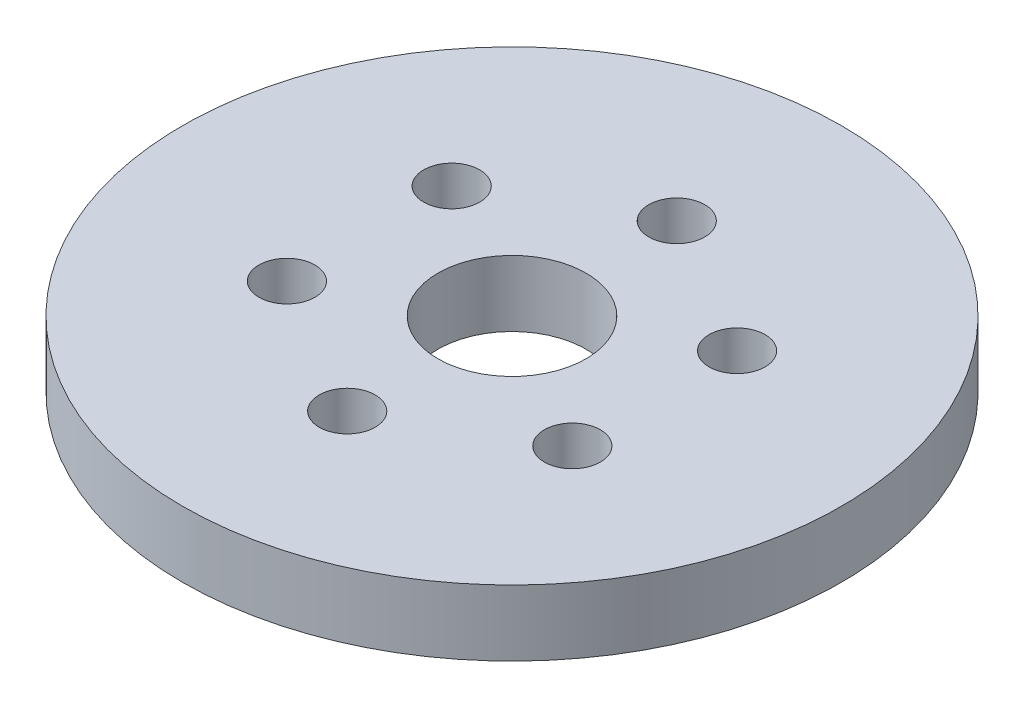
ISO-10303-21;
HEADER;
FILE_DESCRIPTION(('STEP AP214'),'2;1');
FILE_NAME('part.step','',(''),(''),'','','');
FILE_SCHEMA(('AUTOMOTIVE_DESIGN { 1 0 10303 214 1 1 1 1 }'));
ENDSEC;
DATA;
#1=APPLICATION_CONTEXT('core data for automotive mechanical design processes');
#2=APPLICATION_PROTOCOL_DEFINITION('international standard','automotive_design',2000,#1);
#3=PRODUCT_CONTEXT('',#1,'mechanical');
#4=PRODUCT('Part','Part','',(#3));
#5=PRODUCT_RELATED_PRODUCT_CATEGORY('part','',(#4));
#6=PRODUCT_DEFINITION_FORMATION('','',#4);
#7=PRODUCT_DEFINITION_CONTEXT('part definition',#1,'design');
#8=PRODUCT_DEFINITION('design','',#6,#7);
#9=PRODUCT_DEFINITION_SHAPE('','',#8);
#10=(LENGTH_UNIT() NAMED_UNIT(*) SI_UNIT(.MILLI.,.METRE.));
#11=(NAMED_UNIT(*) PLANE_ANGLE_UNIT() SI_UNIT($,.RADIAN.));
#12=(NAMED_UNIT(*) SI_UNIT($,.STERADIAN.) SOLID_ANGLE_UNIT());
#13=UNCERTAINTY_MEASURE_WITH_UNIT(LENGTH_MEASURE(1.E-05),#10,'distance_accuracy_value','');
#14=(GEOMETRIC_REPRESENTATION_CONTEXT(3) GLOBAL_UNCERTAINTY_ASSIGNED_CONTEXT((#13)) GLOBAL_UNIT_ASSIGNED_CONTEXT((#10,
#11,#12)) REPRESENTATION_CONTEXT('',''));
#15=CARTESIAN_POINT('',(0.,0.,0.));
#16=DIRECTION('',(0.,0.,1.));
#17=DIRECTION('',(1.,0.,0.));
#18=AXIS2_PLACEMENT_3D('',#15,#16,#17);
#19=CARTESIAN_POINT('',(0.,4.,0.));
#20=DIRECTION('',(0.,1.,0.));
#21=DIRECTION('',(0.,0.,1.));
#22=AXIS2_PLACEMENT_3D('',#19,#20,#21);
#23=PLANE('',#22);
#24=CARTESIAN_POINT('',(0.,4.,-10.));
#25=DIRECTION('',(0.,1.,0.));
#26=DIRECTION('',(0.,0.,1.));
#27=AXIS2_PLACEMENT_3D('',#24,#25,#26);
#28=CIRCLE('',#27,1.7);
#29=CARTESIAN_POINT('',(0.,4.,-8.3));
#30=VERTEX_POINT('',#29);
#31=EDGE_CURVE('E76',#30,#30,#28,.T.);
#32=ORIENTED_EDGE('',*,*,#31,.F.);
#33=EDGE_LOOP('',(#32));
#34=FACE_BOUND('',#33,.T.);
#35=CARTESIAN_POINT('',(-8.66025403784433,4.,-5.0000000000001));
#36=DIRECTION('',(0.,1.,0.));
#37=DIRECTION('',(0.,0.,1.));
#38=AXIS2_PLACEMENT_3D('',#35,#36,#37);
#39=CIRCLE('',#38,1.7);
#40=CARTESIAN_POINT('',(-8.66025403784433,4.,-3.3000000000001));
#41=VERTEX_POINT('',#40);
#42=EDGE_CURVE('E77',#41,#41,#39,.T.);
#43=ORIENTED_EDGE('',*,*,#42,.F.);
#44=EDGE_LOOP('',(#43));
#45=FACE_BOUND('',#44,.T.);
#46=CARTESIAN_POINT('',(-8.66025403784443,4.,4.99999999999992));
#47=DIRECTION('',(0.,1.,0.));
#48=DIRECTION('',(0.,0.,1.));
#49=AXIS2_PLACEMENT_3D('',#46,#47,#48);
#50=CIRCLE('',#49,1.7);
#51=CARTESIAN_POINT('',(-8.66025403784443,4.,6.69999999999992));
#52=VERTEX_POINT('',#51);
#53=EDGE_CURVE('E51',#52,#52,#50,.T.);
#54=ORIENTED_EDGE('',*,*,#53,.F.);
#55=EDGE_LOOP('',(#54));
#56=FACE_BOUND('',#55,.T.);
#57=CARTESIAN_POINT('',(0.,4.,10.));
#58=DIRECTION('',(0.,1.,0.));
#59=DIRECTION('',(0.,0.,1.));
#60=AXIS2_PLACEMENT_3D('',#57,#58,#59);
#61=CIRCLE('',#60,1.7);
#62=CARTESIAN_POINT('',(0.,4.,11.7));
#63=VERTEX_POINT('',#62);
#64=EDGE_CURVE('E58',#63,#63,#61,.T.);
#65=ORIENTED_EDGE('',*,*,#64,.F.);
#66=EDGE_LOOP('',(#65));
#67=FACE_BOUND('',#66,.T.);
#68=CARTESIAN_POINT('',(8.66025403784437,4.,5.00000000000004));
#69=DIRECTION('',(0.,1.,0.));
#70=DIRECTION('',(0.,0.,1.));
#71=AXIS2_PLACEMENT_3D('',#68,#69,#70);
#72=CIRCLE('',#71,1.7);
#73=CARTESIAN_POINT('',(8.66025403784437,4.,6.70000000000004));
#74=VERTEX_POINT('',#73);
#75=EDGE_CURVE('E64',#74,#74,#72,.T.);
#76=ORIENTED_EDGE('',*,*,#75,.F.);
#77=EDGE_LOOP('',(#76));
#78=FACE_BOUND('',#77,.T.);
#79=CARTESIAN_POINT('',(8.6602540378444,4.,-4.99999999999998));
#80=DIRECTION('',(0.,1.,0.));
#81=DIRECTION('',(0.,0.,1.));
#82=AXIS2_PLACEMENT_3D('',#79,#80,#81);
#83=CIRCLE('',#82,1.7);
#84=CARTESIAN_POINT('',(8.6602540378444,4.,-3.29999999999998));
#85=VERTEX_POINT('',#84);
#86=EDGE_CURVE('E70',#85,#85,#83,.T.);
#87=ORIENTED_EDGE('',*,*,#86,.F.);
#88=EDGE_LOOP('',(#87));
#89=FACE_BOUND('',#88,.T.);
#90=CARTESIAN_POINT('',(0.,4.,0.));
#91=DIRECTION('',(0.,1.,0.));
#92=DIRECTION('',(0.,0.,1.));
#93=AXIS2_PLACEMENT_3D('',#90,#91,#92);
#94=CIRCLE('',#93,20.);
#95=CARTESIAN_POINT('',(0.,4.,20.));
#96=VERTEX_POINT('',#95);
#97=EDGE_CURVE('E10',#96,#96,#94,.T.);
#98=ORIENTED_EDGE('',*,*,#97,.T.);
#99=EDGE_LOOP('',(#98));
#100=FACE_BOUND('',#99,.T.);
#101=CARTESIAN_POINT('',(0.,4.,0.));
#102=DIRECTION('',(0.,1.,0.));
#103=DIRECTION('',(0.,0.,1.));
#104=AXIS2_PLACEMENT_3D('',#101,#102,#103);
#105=CIRCLE('',#104,4.5);
#106=CARTESIAN_POINT('',(0.,4.,4.5));
#107=VERTEX_POINT('',#106);
#108=EDGE_CURVE('E43',#107,#107,#105,.T.);
#109=ORIENTED_EDGE('',*,*,#108,.F.);
#110=EDGE_LOOP('',(#109));
#111=FACE_BOUND('',#110,.T.);
#112=ADVANCED_FACE('F32',(#34,#45,#56,#67,#78,#89,#100,#111),#23,.T.);
#113=CARTESIAN_POINT('',(0.,0.,0.));
#114=DIRECTION('',(0.,1.,0.));
#115=DIRECTION('',(0.,0.,1.));
#116=AXIS2_PLACEMENT_3D('',#113,#114,#115);
#117=PLANE('',#116);
#118=CARTESIAN_POINT('',(0.,0.,-10.));
#119=DIRECTION('',(0.,1.,0.));
#120=DIRECTION('',(0.,0.,1.));
#121=AXIS2_PLACEMENT_3D('',#118,#119,#120);
#122=CIRCLE('',#121,1.7);
#123=CARTESIAN_POINT('',(0.,0.,-8.3));
#124=VERTEX_POINT('',#123);
#125=EDGE_CURVE('E48',#124,#124,#122,.T.);
#126=ORIENTED_EDGE('',*,*,#125,.T.);
#127=EDGE_LOOP('',(#126));
#128=FACE_BOUND('',#127,.T.);
#129=CARTESIAN_POINT('',(-8.66025403784433,0.,-5.0000000000001));
#130=DIRECTION('',(0.,1.,0.));
#131=DIRECTION('',(0.,0.,1.));
#132=AXIS2_PLACEMENT_3D('',#129,#130,#131);
#133=CIRCLE('',#132,1.7);
#134=CARTESIAN_POINT('',(-8.66025403784433,0.,-3.3000000000001));
#135=VERTEX_POINT('',#134);
#136=EDGE_CURVE('E55',#135,#135,#133,.T.);
#137=ORIENTED_EDGE('',*,*,#136,.T.);
#138=EDGE_LOOP('',(#137));
#139=FACE_BOUND('',#138,.T.);
#140=CARTESIAN_POINT('',(-8.66025403784443,0.,4.99999999999992));
#141=DIRECTION('',(0.,1.,0.));
#142=DIRECTION('',(0.,0.,1.));
#143=AXIS2_PLACEMENT_3D('',#140,#141,#142);
#144=CIRCLE('',#143,1.7);
#145=CARTESIAN_POINT('',(-8.66025403784443,0.,6.69999999999992));
#146=VERTEX_POINT('',#145);
#147=EDGE_CURVE('E54',#146,#146,#144,.T.);
#148=ORIENTED_EDGE('',*,*,#147,.T.);
#149=EDGE_LOOP('',(#148));
#150=FACE_BOUND('',#149,.T.);
#151=CARTESIAN_POINT('',(0.,0.,10.));
#152=DIRECTION('',(0.,1.,0.));
#153=DIRECTION('',(0.,0.,1.));
#154=AXIS2_PLACEMENT_3D('',#151,#152,#153);
#155=CIRCLE('',#154,1.7);
#156=CARTESIAN_POINT('',(0.,0.,11.7));
#157=VERTEX_POINT('',#156);
#158=EDGE_CURVE('E61',#157,#157,#155,.T.);
#159=ORIENTED_EDGE('',*,*,#158,.T.);
#160=EDGE_LOOP('',(#159));
#161=FACE_BOUND('',#160,.T.);
#162=CARTESIAN_POINT('',(8.66025403784437,0.,5.00000000000004));
#163=DIRECTION('',(0.,1.,0.));
#164=DIRECTION('',(0.,0.,1.));
#165=AXIS2_PLACEMENT_3D('',#162,#163,#164);
#166=CIRCLE('',#165,1.7);
#167=CARTESIAN_POINT('',(8.66025403784437,0.,6.70000000000004));
#168=VERTEX_POINT('',#167);
#169=EDGE_CURVE('E67',#168,#168,#166,.T.);
#170=ORIENTED_EDGE('',*,*,#169,.T.);
#171=EDGE_LOOP('',(#170));
#172=FACE_BOUND('',#171,.T.);
#173=CARTESIAN_POINT('',(8.6602540378444,0.,-4.99999999999998));
#174=DIRECTION('',(0.,1.,0.));
#175=DIRECTION('',(0.,0.,1.));
#176=AXIS2_PLACEMENT_3D('',#173,#174,#175);
#177=CIRCLE('',#176,1.7);
#178=CARTESIAN_POINT('',(8.6602540378444,0.,-3.29999999999998));
#179=VERTEX_POINT('',#178);
#180=EDGE_CURVE('E73',#179,#179,#177,.T.);
#181=ORIENTED_EDGE('',*,*,#180,.T.);
#182=EDGE_LOOP('',(#181));
#183=FACE_BOUND('',#182,.T.);
#184=CARTESIAN_POINT('',(0.,0.,0.));
#185=DIRECTION('',(0.,1.,0.));
#186=DIRECTION('',(0.,0.,1.));
#187=AXIS2_PLACEMENT_3D('',#184,#185,#186);
#188=CIRCLE('',#187,20.);
#189=CARTESIAN_POINT('',(0.,0.,20.));
#190=VERTEX_POINT('',#189);
#191=EDGE_CURVE('E36',#190,#190,#188,.T.);
#192=ORIENTED_EDGE('',*,*,#191,.F.);
#193=EDGE_LOOP('',(#192));
#194=FACE_BOUND('',#193,.T.);
#195=CARTESIAN_POINT('',(0.,0.,0.));
#196=DIRECTION('',(0.,1.,0.));
#197=DIRECTION('',(0.,0.,1.));
#198=AXIS2_PLACEMENT_3D('',#195,#196,#197);
#199=CIRCLE('',#198,4.5);
#200=CARTESIAN_POINT('',(0.,0.,4.5));
#201=VERTEX_POINT('',#200);
#202=EDGE_CURVE('E45',#201,#201,#199,.T.);
#203=ORIENTED_EDGE('',*,*,#202,.T.);
#204=EDGE_LOOP('',(#203));
#205=FACE_BOUND('',#204,.T.);
#206=ADVANCED_FACE('F87',(#128,#139,#150,#161,#172,#183,#194,#205),#117,.F.);
#207=CARTESIAN_POINT('',(0.,4.,0.));
#208=DIRECTION('',(0.,-1.,0.));
#209=DIRECTION('',(0.,0.,-1.));
#210=AXIS2_PLACEMENT_3D('',#207,#208,#209);
#211=CYLINDRICAL_SURFACE('',#210,20.);
#212=ORIENTED_EDGE('',*,*,#97,.F.);
#213=EDGE_LOOP('',(#212));
#214=FACE_BOUND('',#213,.T.);
#215=ORIENTED_EDGE('',*,*,#191,.T.);
#216=EDGE_LOOP('',(#215));
#217=FACE_BOUND('',#216,.T.);
#218=ADVANCED_FACE('F34',(#214,#217),#211,.T.);
#219=CARTESIAN_POINT('',(0.,4.,0.));
#220=DIRECTION('',(0.,-1.,0.));
#221=DIRECTION('',(0.,0.,-1.));
#222=AXIS2_PLACEMENT_3D('',#219,#220,#221);
#223=CYLINDRICAL_SURFACE('',#222,4.5);
#224=ORIENTED_EDGE('',*,*,#108,.T.);
#225=EDGE_LOOP('',(#224));
#226=FACE_BOUND('',#225,.T.);
#227=ORIENTED_EDGE('',*,*,#202,.F.);
#228=EDGE_LOOP('',(#227));
#229=FACE_BOUND('',#228,.T.);
#230=ADVANCED_FACE('F112',(#226,#229),#223,.F.);
#231=CARTESIAN_POINT('',(8.6602540378444,0.,-4.99999999999998));
#232=DIRECTION('',(0.,1.,0.));
#233=DIRECTION('',(0.,0.,1.));
#234=AXIS2_PLACEMENT_3D('',#231,#232,#233);
#235=CYLINDRICAL_SURFACE('',#234,1.7);
#236=ORIENTED_EDGE('',*,*,#180,.F.);
#237=EDGE_LOOP('',(#236));
#238=FACE_BOUND('',#237,.T.);
#239=ORIENTED_EDGE('',*,*,#86,.T.);
#240=EDGE_LOOP('',(#239));
#241=FACE_BOUND('',#240,.T.);
#242=ADVANCED_FACE('F115',(#238,#241),#235,.F.);
#243=CARTESIAN_POINT('',(8.66025403784437,0.,5.00000000000004));
#244=DIRECTION('',(0.,1.,0.));
#245=DIRECTION('',(0.,0.,1.));
#246=AXIS2_PLACEMENT_3D('',#243,#244,#245);
#247=CYLINDRICAL_SURFACE('',#246,1.7);
#248=ORIENTED_EDGE('',*,*,#169,.F.);
#249=EDGE_LOOP('',(#248));
#250=FACE_BOUND('',#249,.T.);
#251=ORIENTED_EDGE('',*,*,#75,.T.);
#252=EDGE_LOOP('',(#251));
#253=FACE_BOUND('',#252,.T.);
#254=ADVANCED_FACE('F132',(#250,#253),#247,.F.);
#255=CARTESIAN_POINT('',(0.,0.,10.));
#256=DIRECTION('',(0.,1.,0.));
#257=DIRECTION('',(0.,0.,1.));
#258=AXIS2_PLACEMENT_3D('',#255,#256,#257);
#259=CYLINDRICAL_SURFACE('',#258,1.7);
#260=ORIENTED_EDGE('',*,*,#158,.F.);
#261=EDGE_LOOP('',(#260));
#262=FACE_BOUND('',#261,.T.);
#263=ORIENTED_EDGE('',*,*,#64,.T.);
#264=EDGE_LOOP('',(#263));
#265=FACE_BOUND('',#264,.T.);
#266=ADVANCED_FACE('F128',(#262,#265),#259,.F.);
#267=CARTESIAN_POINT('',(-8.66025403784443,0.,4.99999999999992));
#268=DIRECTION('',(0.,1.,0.));
#269=DIRECTION('',(0.,0.,1.));
#270=AXIS2_PLACEMENT_3D('',#267,#268,#269);
#271=CYLINDRICAL_SURFACE('',#270,1.7);
#272=ORIENTED_EDGE('',*,*,#147,.F.);
#273=EDGE_LOOP('',(#272));
#274=FACE_BOUND('',#273,.T.);
#275=ORIENTED_EDGE('',*,*,#53,.T.);
#276=EDGE_LOOP('',(#275));
#277=FACE_BOUND('',#276,.T.);
#278=ADVANCED_FACE('F125',(#274,#277),#271,.F.);
#279=CARTESIAN_POINT('',(-8.66025403784433,0.,-5.0000000000001));
#280=DIRECTION('',(0.,1.,0.));
#281=DIRECTION('',(0.,0.,1.));
#282=AXIS2_PLACEMENT_3D('',#279,#280,#281);
#283=CYLINDRICAL_SURFACE('',#282,1.7);
#284=ORIENTED_EDGE('',*,*,#136,.F.);
#285=EDGE_LOOP('',(#284));
#286=FACE_BOUND('',#285,.T.);
#287=ORIENTED_EDGE('',*,*,#42,.T.);
#288=EDGE_LOOP('',(#287));
#289=FACE_BOUND('',#288,.T.);
#290=ADVANCED_FACE('F93',(#286,#289),#283,.F.);
#291=CARTESIAN_POINT('',(0.,0.,-10.));
#292=DIRECTION('',(0.,1.,0.));
#293=DIRECTION('',(0.,0.,1.));
#294=AXIS2_PLACEMENT_3D('',#291,#292,#293);
#295=CYLINDRICAL_SURFACE('',#294,1.7);
#296=ORIENTED_EDGE('',*,*,#125,.F.);
#297=EDGE_LOOP('',(#296));
#298=FACE_BOUND('',#297,.T.);
#299=ORIENTED_EDGE('',*,*,#31,.T.);
#300=EDGE_LOOP('',(#299));
#301=FACE_BOUND('',#300,.T.);
#302=ADVANCED_FACE('F90',(#298,#301),#295,.F.);
#303=CLOSED_SHELL('',(#112,#206,#218,#230,#242,#254,#266,#278,#290,#302));
#304=MANIFOLD_SOLID_BREP('B2',#303);
#305=ADVANCED_BREP_SHAPE_REPRESENTATION('',(#18,#304),#14);
#306=SHAPE_DEFINITION_REPRESENTATION(#9,#305);
ENDSEC;
END-ISO-10303-21;
